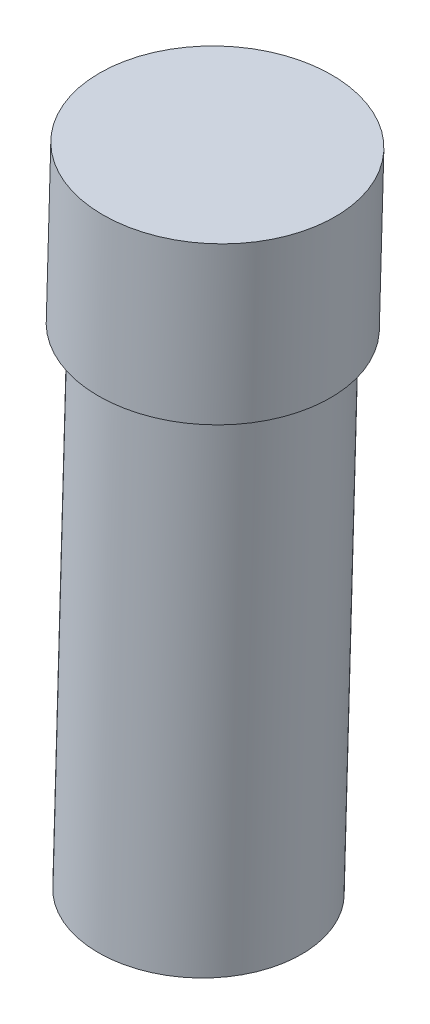
ISO-10303-21;
HEADER;
FILE_DESCRIPTION(('STEP AP214'),'2;1');
FILE_NAME('part.step','',(''),(''),'','','');
FILE_SCHEMA(('AUTOMOTIVE_DESIGN { 1 0 10303 214 1 1 1 1 }'));
ENDSEC;
DATA;
#1=APPLICATION_CONTEXT('core data for automotive mechanical design processes');
#2=APPLICATION_PROTOCOL_DEFINITION('international standard','automotive_design',2000,#1);
#3=PRODUCT_CONTEXT('',#1,'mechanical');
#4=PRODUCT('Part','Part','',(#3));
#5=PRODUCT_RELATED_PRODUCT_CATEGORY('part','',(#4));
#6=PRODUCT_DEFINITION_FORMATION('','',#4);
#7=PRODUCT_DEFINITION_CONTEXT('part definition',#1,'design');
#8=PRODUCT_DEFINITION('design','',#6,#7);
#9=PRODUCT_DEFINITION_SHAPE('','',#8);
#10=(LENGTH_UNIT() NAMED_UNIT(*) SI_UNIT(.MILLI.,.METRE.));
#11=(NAMED_UNIT(*) PLANE_ANGLE_UNIT() SI_UNIT($,.RADIAN.));
#12=(NAMED_UNIT(*) SI_UNIT($,.STERADIAN.) SOLID_ANGLE_UNIT());
#13=UNCERTAINTY_MEASURE_WITH_UNIT(LENGTH_MEASURE(1.E-05),#10,'distance_accuracy_value','');
#14=(GEOMETRIC_REPRESENTATION_CONTEXT(3) GLOBAL_UNCERTAINTY_ASSIGNED_CONTEXT((#13)) GLOBAL_UNIT_ASSIGNED_CONTEXT((#10,
#11,#12)) REPRESENTATION_CONTEXT('',''));
#15=CARTESIAN_POINT('',(0.,0.,0.));
#16=DIRECTION('',(0.,0.,1.));
#17=DIRECTION('',(1.,0.,0.));
#18=AXIS2_PLACEMENT_3D('',#15,#16,#17);
#19=CARTESIAN_POINT('',(-223.5172010649,-43.297489593268,-134.221294922));
#20=DIRECTION('',(0.0287732149581037,0.999585965338137,0.));
#21=DIRECTION('',(-0.999585965338137,0.0287732149581037,0.));
#22=AXIS2_PLACEMENT_3D('',#19,#20,#21);
#23=CYLINDRICAL_SURFACE('',#22,7.);
#24=CARTESIAN_POINT('',(-223.511408179055,-43.0962438375508,-134.221294922));
#25=DIRECTION('',(0.0287732149581037,0.999585965338137,0.));
#26=DIRECTION('',(-0.999585965338137,0.0287732149581037,0.));
#27=AXIS2_PLACEMENT_3D('',#24,#25,#26);
#28=CIRCLE('',#27,6.99999999999999);
#29=CARTESIAN_POINT('',(-230.508509936422,-42.894831332844,-134.221294922));
#30=VERTEX_POINT('',#29);
#31=EDGE_CURVE('E52',#30,#30,#28,.T.);
#32=ORIENTED_EDGE('',*,*,#31,.T.);
#33=EDGE_LOOP('',(#32));
#34=FACE_BOUND('',#33,.T.);
#35=CARTESIAN_POINT('',(-222.540207951833,-9.35659680547125,-134.221294922));
#36=DIRECTION('',(0.0287732149581037,0.999585965338137,0.));
#37=DIRECTION('',(-0.999585965338137,0.0287732149581037,0.));
#38=AXIS2_PLACEMENT_3D('',#35,#36,#37);
#39=CIRCLE('',#38,6.99999999999998);
#40=CARTESIAN_POINT('',(-229.5373097092,-9.15518430076452,-134.221294922));
#41=VERTEX_POINT('',#40);
#42=EDGE_CURVE('E10',#41,#41,#39,.T.);
#43=ORIENTED_EDGE('',*,*,#42,.F.);
#44=EDGE_LOOP('',(#43));
#45=FACE_BOUND('',#44,.T.);
#46=ADVANCED_FACE('F38',(#34,#45),#23,.T.);
#47=CARTESIAN_POINT('',(-214.543520229128,-9.5867825251368,-134.221294922));
#48=DIRECTION('',(-0.0287732149581037,-0.999585965338137,0.));
#49=DIRECTION('',(0.999585965338137,-0.0287732149581037,0.));
#50=AXIS2_PLACEMENT_3D('',#47,#48,#49);
#51=PLANE('',#50);
#52=ORIENTED_EDGE('',*,*,#42,.T.);
#53=EDGE_LOOP('',(#52));
#54=FACE_BOUND('',#53,.T.);
#55=CARTESIAN_POINT('',(-222.540207951833,-9.35659680547266,-134.221294922));
#56=DIRECTION('',(0.0287732149581037,0.999585965338137,0.));
#57=DIRECTION('',(-0.999585965338137,0.0287732149581037,0.));
#58=AXIS2_PLACEMENT_3D('',#55,#56,#57);
#59=CIRCLE('',#58,8.00000000000061);
#60=CARTESIAN_POINT('',(-230.536895674539,-9.12641108580782,-134.221294922));
#61=VERTEX_POINT('',#60);
#62=EDGE_CURVE('E44',#61,#61,#59,.T.);
#63=ORIENTED_EDGE('',*,*,#62,.F.);
#64=EDGE_LOOP('',(#63));
#65=FACE_BOUND('',#64,.T.);
#66=ADVANCED_FACE('F71',(#54,#65),#51,.T.);
#67=CARTESIAN_POINT('',(-223.5172010649,-43.297489593268,-134.221294922));
#68=DIRECTION('',(0.0287732149581037,0.999585965338137,0.));
#69=DIRECTION('',(-0.999585965338137,0.0287732149581037,0.));
#70=AXIS2_PLACEMENT_3D('',#67,#68,#69);
#71=CYLINDRICAL_SURFACE('',#70,8.0000000000003);
#72=ORIENTED_EDGE('',*,*,#62,.T.);
#73=EDGE_LOOP('',(#72));
#74=FACE_BOUND('',#73,.T.);
#75=CARTESIAN_POINT('',(-222.229314454943,1.44389165781517,-134.221294922));
#76=DIRECTION('',(0.0287732149581037,0.999585965338137,0.));
#77=DIRECTION('',(-0.999585965338137,0.0287732149581037,0.));
#78=AXIS2_PLACEMENT_3D('',#75,#76,#77);
#79=CIRCLE('',#78,8.);
#80=CARTESIAN_POINT('',(-230.226002177648,1.67407737748,-134.221294922));
#81=VERTEX_POINT('',#80);
#82=EDGE_CURVE('E48',#81,#81,#79,.T.);
#83=ORIENTED_EDGE('',*,*,#82,.F.);
#84=EDGE_LOOP('',(#83));
#85=FACE_BOUND('',#84,.T.);
#86=ADVANCED_FACE('F67',(#74,#85),#71,.T.);
#87=CARTESIAN_POINT('',(-222.229314454943,1.44389165781361,-134.221294922));
#88=DIRECTION('',(0.0287732149581037,0.999585965338137,0.));
#89=DIRECTION('',(-0.999585965338137,0.0287732149581037,0.));
#90=AXIS2_PLACEMENT_3D('',#87,#88,#89);
#91=PLANE('',#90);
#92=ORIENTED_EDGE('',*,*,#82,.T.);
#93=EDGE_LOOP('',(#92));
#94=FACE_BOUND('',#93,.T.);
#95=ADVANCED_FACE('F62',(#94),#91,.T.);
#96=CARTESIAN_POINT('',(-216.514306421688,-43.2976563422313,-134.221294922));
#97=DIRECTION('',(-0.0287732149581037,-0.999585965338137,0.));
#98=DIRECTION('',(0.999585965338137,-0.0287732149581037,0.));
#99=AXIS2_PLACEMENT_3D('',#96,#97,#98);
#100=PLANE('',#99);
#101=ORIENTED_EDGE('',*,*,#31,.F.);
#102=EDGE_LOOP('',(#101));
#103=FACE_BOUND('',#102,.T.);
#104=ADVANCED_FACE('F60',(#103),#100,.T.);
#105=CLOSED_SHELL('',(#46,#66,#86,#95,#104));
#106=MANIFOLD_SOLID_BREP('B2',#105);
#107=ADVANCED_BREP_SHAPE_REPRESENTATION('',(#18,#106),#14);
#108=SHAPE_DEFINITION_REPRESENTATION(#9,#107);
ENDSEC;
END-ISO-10303-21;
